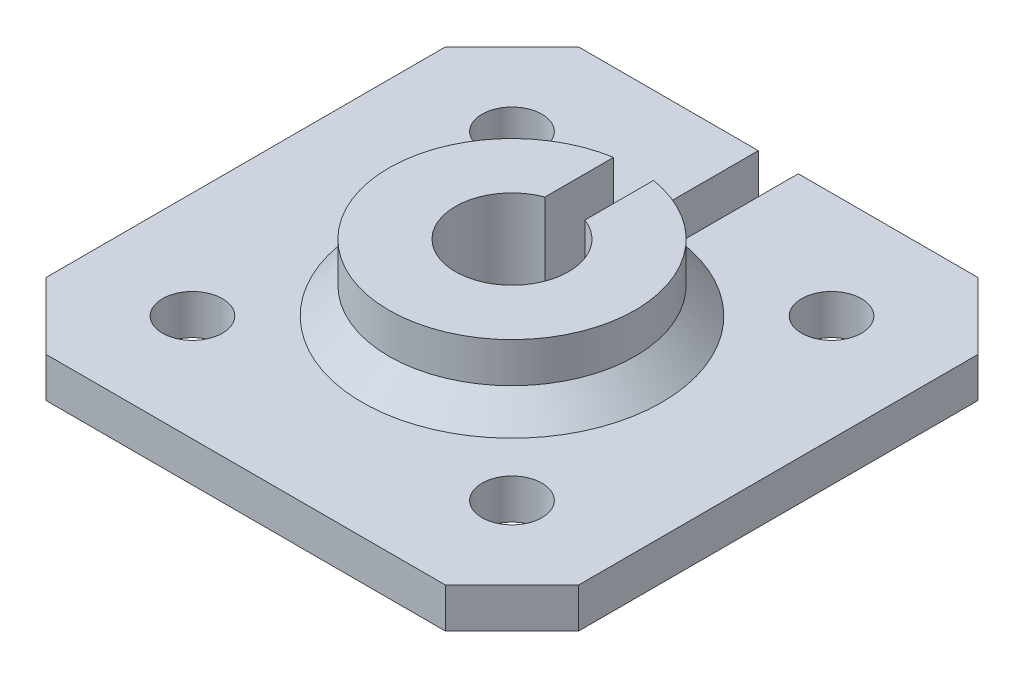
ISO-10303-21;
HEADER;
FILE_DESCRIPTION(('STEP AP214'),'2;1');
FILE_NAME('part.step','',(''),(''),'','','');
FILE_SCHEMA(('AUTOMOTIVE_DESIGN { 1 0 10303 214 1 1 1 1 }'));
ENDSEC;
DATA;
#1=APPLICATION_CONTEXT('core data for automotive mechanical design processes');
#2=APPLICATION_PROTOCOL_DEFINITION('international standard','automotive_design',2000,#1);
#3=PRODUCT_CONTEXT('',#1,'mechanical');
#4=PRODUCT('Part','Part','',(#3));
#5=PRODUCT_RELATED_PRODUCT_CATEGORY('part','',(#4));
#6=PRODUCT_DEFINITION_FORMATION('','',#4);
#7=PRODUCT_DEFINITION_CONTEXT('part definition',#1,'design');
#8=PRODUCT_DEFINITION('design','',#6,#7);
#9=PRODUCT_DEFINITION_SHAPE('','',#8);
#10=(LENGTH_UNIT() NAMED_UNIT(*) SI_UNIT(.MILLI.,.METRE.));
#11=(NAMED_UNIT(*) PLANE_ANGLE_UNIT() SI_UNIT($,.RADIAN.));
#12=(NAMED_UNIT(*) SI_UNIT($,.STERADIAN.) SOLID_ANGLE_UNIT());
#13=UNCERTAINTY_MEASURE_WITH_UNIT(LENGTH_MEASURE(1.E-05),#10,'distance_accuracy_value','');
#14=(GEOMETRIC_REPRESENTATION_CONTEXT(3) GLOBAL_UNCERTAINTY_ASSIGNED_CONTEXT((#13)) GLOBAL_UNIT_ASSIGNED_CONTEXT((#10,
#11,#12)) REPRESENTATION_CONTEXT('',''));
#15=CARTESIAN_POINT('',(0.,0.,0.));
#16=DIRECTION('',(0.,0.,1.));
#17=DIRECTION('',(1.,0.,0.));
#18=AXIS2_PLACEMENT_3D('',#15,#16,#17);
#19=CARTESIAN_POINT('',(0.,3.,0.));
#20=DIRECTION('',(0.,1.,0.));
#21=DIRECTION('',(0.,0.,1.));
#22=AXIS2_PLACEMENT_3D('',#19,#20,#21);
#23=PLANE('',#22);
#24=CARTESIAN_POINT('',(12.,3.,12.));
#25=DIRECTION('',(0.,1.,0.));
#26=DIRECTION('',(0.,0.,1.));
#27=AXIS2_PLACEMENT_3D('',#24,#25,#26);
#28=CIRCLE('',#27,2.25);
#29=CARTESIAN_POINT('',(12.,3.,14.25));
#30=VERTEX_POINT('',#29);
#31=EDGE_CURVE('E193',#30,#30,#28,.T.);
#32=ORIENTED_EDGE('',*,*,#31,.F.);
#33=EDGE_LOOP('',(#32));
#34=FACE_BOUND('',#33,.T.);
#35=CARTESIAN_POINT('',(-12.,3.,-12.));
#36=DIRECTION('',(0.,1.,0.));
#37=DIRECTION('',(0.,0.,1.));
#38=AXIS2_PLACEMENT_3D('',#35,#36,#37);
#39=CIRCLE('',#38,2.25);
#40=CARTESIAN_POINT('',(-12.,3.,-9.75));
#41=VERTEX_POINT('',#40);
#42=EDGE_CURVE('E205',#41,#41,#39,.T.);
#43=ORIENTED_EDGE('',*,*,#42,.F.);
#44=EDGE_LOOP('',(#43));
#45=FACE_BOUND('',#44,.T.);
#46=CARTESIAN_POINT('',(-12.,3.,12.));
#47=DIRECTION('',(0.,1.,0.));
#48=DIRECTION('',(0.,0.,1.));
#49=AXIS2_PLACEMENT_3D('',#46,#47,#48);
#50=CIRCLE('',#49,2.25);
#51=CARTESIAN_POINT('',(-12.,3.,14.25));
#52=VERTEX_POINT('',#51);
#53=EDGE_CURVE('E211',#52,#52,#50,.T.);
#54=ORIENTED_EDGE('',*,*,#53,.F.);
#55=EDGE_LOOP('',(#54));
#56=FACE_BOUND('',#55,.T.);
#57=CARTESIAN_POINT('',(12.,3.,-12.));
#58=DIRECTION('',(0.,1.,0.));
#59=DIRECTION('',(0.,0.,1.));
#60=AXIS2_PLACEMENT_3D('',#57,#58,#59);
#61=CIRCLE('',#60,2.25);
#62=CARTESIAN_POINT('',(12.,3.,-9.75));
#63=VERTEX_POINT('',#62);
#64=EDGE_CURVE('E199',#63,#63,#61,.T.);
#65=ORIENTED_EDGE('',*,*,#64,.F.);
#66=EDGE_LOOP('',(#65));
#67=FACE_BOUND('',#66,.T.);
#68=DIRECTION('',(0.,0.,1.));
#69=VECTOR('',#68,1.);
#70=CARTESIAN_POINT('',(1.5,3.,0.));
#71=LINE('',#70,#69);
#72=CARTESIAN_POINT('',(1.5,3.,-20.));
#73=VERTEX_POINT('',#72);
#74=CARTESIAN_POINT('',(1.5,3.,-11.1495515604889));
#75=VERTEX_POINT('',#74);
#76=EDGE_CURVE('E160',#73,#75,#71,.T.);
#77=ORIENTED_EDGE('',*,*,#76,.T.);
#78=CARTESIAN_POINT('',(0.,3.,0.));
#79=DIRECTION('',(0.,1.,0.));
#80=DIRECTION('',(0.,0.,1.));
#81=AXIS2_PLACEMENT_3D('',#78,#79,#80);
#82=CIRCLE('',#81,11.25);
#83=CARTESIAN_POINT('',(-1.5,3.,-11.1495515604889));
#84=VERTEX_POINT('',#83);
#85=EDGE_CURVE('E52',#75,#84,#82,.F.);
#86=ORIENTED_EDGE('',*,*,#85,.T.);
#87=DIRECTION('',(0.,0.,1.));
#88=VECTOR('',#87,1.);
#89=CARTESIAN_POINT('',(-1.5,3.,0.));
#90=LINE('',#89,#88);
#91=CARTESIAN_POINT('',(-1.5,3.,-20.));
#92=VERTEX_POINT('',#91);
#93=EDGE_CURVE('E161',#92,#84,#90,.T.);
#94=ORIENTED_EDGE('',*,*,#93,.F.);
#95=DIRECTION('',(-1.,0.,0.));
#96=VECTOR('',#95,1.);
#97=CARTESIAN_POINT('',(-20.,3.,-20.));
#98=LINE('',#97,#96);
#99=CARTESIAN_POINT('',(-15.,3.,-20.));
#100=VERTEX_POINT('',#99);
#101=EDGE_CURVE('E221',#92,#100,#98,.T.);
#102=ORIENTED_EDGE('',*,*,#101,.T.);
#103=DIRECTION('',(0.707106781186549,0.,-0.707106781186546));
#104=VECTOR('',#103,1.);
#105=CARTESIAN_POINT('',(-17.5,3.,-17.5));
#106=LINE('',#105,#104);
#107=CARTESIAN_POINT('',(-20.,3.,-15.));
#108=VERTEX_POINT('',#107);
#109=EDGE_CURVE('E258',#100,#108,#106,.F.);
#110=ORIENTED_EDGE('',*,*,#109,.T.);
#111=DIRECTION('',(0.,0.,1.));
#112=VECTOR('',#111,1.);
#113=CARTESIAN_POINT('',(-20.,3.,-20.));
#114=LINE('',#113,#112);
#115=CARTESIAN_POINT('',(-20.,3.,15.));
#116=VERTEX_POINT('',#115);
#117=EDGE_CURVE('E225',#108,#116,#114,.T.);
#118=ORIENTED_EDGE('',*,*,#117,.T.);
#119=DIRECTION('',(-0.707106781186546,0.,-0.707106781186549));
#120=VECTOR('',#119,1.);
#121=CARTESIAN_POINT('',(-17.5,3.,17.5));
#122=LINE('',#121,#120);
#123=CARTESIAN_POINT('',(-15.,3.,20.));
#124=VERTEX_POINT('',#123);
#125=EDGE_CURVE('E256',#116,#124,#122,.F.);
#126=ORIENTED_EDGE('',*,*,#125,.T.);
#127=DIRECTION('',(1.,0.,0.));
#128=VECTOR('',#127,1.);
#129=CARTESIAN_POINT('',(-20.,3.,20.));
#130=LINE('',#129,#128);
#131=CARTESIAN_POINT('',(15.,3.,20.));
#132=VERTEX_POINT('',#131);
#133=EDGE_CURVE('E228',#124,#132,#130,.T.);
#134=ORIENTED_EDGE('',*,*,#133,.T.);
#135=DIRECTION('',(-0.707106781186549,0.,0.707106781186546));
#136=VECTOR('',#135,1.);
#137=CARTESIAN_POINT('',(17.5,3.,17.5));
#138=LINE('',#137,#136);
#139=CARTESIAN_POINT('',(20.,3.,15.));
#140=VERTEX_POINT('',#139);
#141=EDGE_CURVE('E260',#132,#140,#138,.F.);
#142=ORIENTED_EDGE('',*,*,#141,.T.);
#143=DIRECTION('',(0.,0.,-1.));
#144=VECTOR('',#143,1.);
#145=CARTESIAN_POINT('',(20.,3.,-20.));
#146=LINE('',#145,#144);
#147=CARTESIAN_POINT('',(20.,3.,-15.));
#148=VERTEX_POINT('',#147);
#149=EDGE_CURVE('E218',#140,#148,#146,.T.);
#150=ORIENTED_EDGE('',*,*,#149,.T.);
#151=DIRECTION('',(0.707106781186546,0.,0.707106781186549));
#152=VECTOR('',#151,1.);
#153=CARTESIAN_POINT('',(17.5,3.,-17.5));
#154=LINE('',#153,#152);
#155=CARTESIAN_POINT('',(15.,3.,-20.));
#156=VERTEX_POINT('',#155);
#157=EDGE_CURVE('E262',#148,#156,#154,.F.);
#158=ORIENTED_EDGE('',*,*,#157,.T.);
#159=EDGE_CURVE('E223',#156,#73,#98,.T.);
#160=ORIENTED_EDGE('',*,*,#159,.T.);
#161=EDGE_LOOP('',(#77,#86,#94,#102,#110,#118,#126,#134,#142,#150,#158,#160));
#162=FACE_BOUND('',#161,.T.);
#163=ADVANCED_FACE('F32',(#34,#45,#56,#67,#162),#23,.T.);
#164=CARTESIAN_POINT('',(0.,0.,0.));
#165=DIRECTION('',(0.,1.,0.));
#166=DIRECTION('',(0.,0.,1.));
#167=AXIS2_PLACEMENT_3D('',#164,#165,#166);
#168=PLANE('',#167);
#169=CARTESIAN_POINT('',(12.,0.,12.));
#170=DIRECTION('',(0.,1.,0.));
#171=DIRECTION('',(0.,0.,1.));
#172=AXIS2_PLACEMENT_3D('',#169,#170,#171);
#173=CIRCLE('',#172,2.25);
#174=CARTESIAN_POINT('',(12.,0.,14.25));
#175=VERTEX_POINT('',#174);
#176=EDGE_CURVE('E192',#175,#175,#173,.T.);
#177=ORIENTED_EDGE('',*,*,#176,.T.);
#178=EDGE_LOOP('',(#177));
#179=FACE_BOUND('',#178,.T.);
#180=CARTESIAN_POINT('',(12.,0.,-12.));
#181=DIRECTION('',(0.,1.,0.));
#182=DIRECTION('',(0.,0.,1.));
#183=AXIS2_PLACEMENT_3D('',#180,#181,#182);
#184=CIRCLE('',#183,2.25);
#185=CARTESIAN_POINT('',(12.,0.,-9.75));
#186=VERTEX_POINT('',#185);
#187=EDGE_CURVE('E196',#186,#186,#184,.T.);
#188=ORIENTED_EDGE('',*,*,#187,.T.);
#189=EDGE_LOOP('',(#188));
#190=FACE_BOUND('',#189,.T.);
#191=CARTESIAN_POINT('',(-12.,0.,-12.));
#192=DIRECTION('',(0.,1.,0.));
#193=DIRECTION('',(0.,0.,1.));
#194=AXIS2_PLACEMENT_3D('',#191,#192,#193);
#195=CIRCLE('',#194,2.25);
#196=CARTESIAN_POINT('',(-12.,0.,-9.75));
#197=VERTEX_POINT('',#196);
#198=EDGE_CURVE('E202',#197,#197,#195,.T.);
#199=ORIENTED_EDGE('',*,*,#198,.T.);
#200=EDGE_LOOP('',(#199));
#201=FACE_BOUND('',#200,.T.);
#202=CARTESIAN_POINT('',(-12.,0.,12.));
#203=DIRECTION('',(0.,1.,0.));
#204=DIRECTION('',(0.,0.,1.));
#205=AXIS2_PLACEMENT_3D('',#202,#203,#204);
#206=CIRCLE('',#205,2.25);
#207=CARTESIAN_POINT('',(-12.,0.,14.25));
#208=VERTEX_POINT('',#207);
#209=EDGE_CURVE('E208',#208,#208,#206,.T.);
#210=ORIENTED_EDGE('',*,*,#209,.T.);
#211=EDGE_LOOP('',(#210));
#212=FACE_BOUND('',#211,.T.);
#213=DIRECTION('',(-1.,0.,0.));
#214=VECTOR('',#213,1.);
#215=CARTESIAN_POINT('',(-20.,0.,-20.));
#216=LINE('',#215,#214);
#217=CARTESIAN_POINT('',(15.,0.,-20.));
#218=VERTEX_POINT('',#217);
#219=CARTESIAN_POINT('',(1.5,0.,-20.));
#220=VERTEX_POINT('',#219);
#221=EDGE_CURVE('E145',#218,#220,#216,.T.);
#222=ORIENTED_EDGE('',*,*,#221,.F.);
#223=DIRECTION('',(-0.707106781186546,0.,-0.707106781186549));
#224=VECTOR('',#223,1.);
#225=CARTESIAN_POINT('',(15.,0.,-20.));
#226=LINE('',#225,#224);
#227=CARTESIAN_POINT('',(20.,0.,-15.));
#228=VERTEX_POINT('',#227);
#229=EDGE_CURVE('E249',#218,#228,#226,.F.);
#230=ORIENTED_EDGE('',*,*,#229,.T.);
#231=DIRECTION('',(0.,0.,-1.));
#232=VECTOR('',#231,1.);
#233=CARTESIAN_POINT('',(20.,0.,-20.));
#234=LINE('',#233,#232);
#235=CARTESIAN_POINT('',(20.,0.,15.));
#236=VERTEX_POINT('',#235);
#237=EDGE_CURVE('E217',#236,#228,#234,.T.);
#238=ORIENTED_EDGE('',*,*,#237,.F.);
#239=DIRECTION('',(0.707106781186549,0.,-0.707106781186546));
#240=VECTOR('',#239,1.);
#241=CARTESIAN_POINT('',(20.,0.,15.));
#242=LINE('',#241,#240);
#243=CARTESIAN_POINT('',(15.,0.,20.));
#244=VERTEX_POINT('',#243);
#245=EDGE_CURVE('E247',#236,#244,#242,.F.);
#246=ORIENTED_EDGE('',*,*,#245,.T.);
#247=DIRECTION('',(1.,0.,0.));
#248=VECTOR('',#247,1.);
#249=CARTESIAN_POINT('',(-20.,0.,20.));
#250=LINE('',#249,#248);
#251=CARTESIAN_POINT('',(-15.,0.,20.));
#252=VERTEX_POINT('',#251);
#253=EDGE_CURVE('E222',#252,#244,#250,.T.);
#254=ORIENTED_EDGE('',*,*,#253,.F.);
#255=DIRECTION('',(0.707106781186546,0.,0.707106781186549));
#256=VECTOR('',#255,1.);
#257=CARTESIAN_POINT('',(-15.,0.,20.));
#258=LINE('',#257,#256);
#259=CARTESIAN_POINT('',(-20.,0.,15.));
#260=VERTEX_POINT('',#259);
#261=EDGE_CURVE('E243',#252,#260,#258,.F.);
#262=ORIENTED_EDGE('',*,*,#261,.T.);
#263=DIRECTION('',(0.,0.,1.));
#264=VECTOR('',#263,1.);
#265=CARTESIAN_POINT('',(-20.,0.,-20.));
#266=LINE('',#265,#264);
#267=CARTESIAN_POINT('',(-20.,0.,-15.));
#268=VERTEX_POINT('',#267);
#269=EDGE_CURVE('E154',#268,#260,#266,.T.);
#270=ORIENTED_EDGE('',*,*,#269,.F.);
#271=DIRECTION('',(-0.707106781186549,0.,0.707106781186546));
#272=VECTOR('',#271,1.);
#273=CARTESIAN_POINT('',(-20.,0.,-15.));
#274=LINE('',#273,#272);
#275=CARTESIAN_POINT('',(-15.,0.,-20.));
#276=VERTEX_POINT('',#275);
#277=EDGE_CURVE('E245',#268,#276,#274,.F.);
#278=ORIENTED_EDGE('',*,*,#277,.T.);
#279=CARTESIAN_POINT('',(-1.5,0.,-20.));
#280=VERTEX_POINT('',#279);
#281=EDGE_CURVE('E155',#280,#276,#216,.T.);
#282=ORIENTED_EDGE('',*,*,#281,.F.);
#283=DIRECTION('',(0.,0.,-1.));
#284=VECTOR('',#283,1.);
#285=CARTESIAN_POINT('',(-1.5,0.,0.));
#286=LINE('',#285,#284);
#287=CARTESIAN_POINT('',(-1.5,0.,-3.97649343014672));
#288=VERTEX_POINT('',#287);
#289=EDGE_CURVE('E169',#288,#280,#286,.T.);
#290=ORIENTED_EDGE('',*,*,#289,.F.);
#291=CARTESIAN_POINT('',(0.,0.,0.));
#292=DIRECTION('',(0.,1.,0.));
#293=DIRECTION('',(0.,0.,1.));
#294=AXIS2_PLACEMENT_3D('',#291,#292,#293);
#295=CIRCLE('',#294,4.25);
#296=CARTESIAN_POINT('',(1.5,0.,-3.97649343014672));
#297=VERTEX_POINT('',#296);
#298=EDGE_CURVE('E168',#288,#297,#295,.T.);
#299=ORIENTED_EDGE('',*,*,#298,.T.);
#300=DIRECTION('',(0.,0.,-1.));
#301=VECTOR('',#300,1.);
#302=CARTESIAN_POINT('',(1.5,0.,0.));
#303=LINE('',#302,#301);
#304=EDGE_CURVE('E158',#297,#220,#303,.T.);
#305=ORIENTED_EDGE('',*,*,#304,.T.);
#306=EDGE_LOOP('',(#222,#230,#238,#246,#254,#262,#270,#278,#282,#290,#299,#305));
#307=FACE_BOUND('',#306,.T.);
#308=ADVANCED_FACE('F165',(#179,#190,#201,#212,#307),#168,.F.);
#309=CARTESIAN_POINT('',(-20.,3.,-20.));
#310=DIRECTION('',(0.,0.,1.));
#311=DIRECTION('',(1.,0.,0.));
#312=AXIS2_PLACEMENT_3D('',#309,#310,#311);
#313=PLANE('',#312);
#314=ORIENTED_EDGE('',*,*,#159,.F.);
#315=DIRECTION('',(0.,-1.,0.));
#316=VECTOR('',#315,1.);
#317=CARTESIAN_POINT('',(15.,3.,-20.));
#318=LINE('',#317,#316);
#319=EDGE_CURVE('E151',#156,#218,#318,.T.);
#320=ORIENTED_EDGE('',*,*,#319,.T.);
#321=ORIENTED_EDGE('',*,*,#221,.T.);
#322=DIRECTION('',(0.,-1.,0.));
#323=VECTOR('',#322,1.);
#324=CARTESIAN_POINT('',(1.5,8.,-20.));
#325=LINE('',#324,#323);
#326=EDGE_CURVE('E149',#73,#220,#325,.T.);
#327=ORIENTED_EDGE('',*,*,#326,.F.);
#328=EDGE_LOOP('',(#314,#320,#321,#327));
#329=FACE_BOUND('',#328,.T.);
#330=ADVANCED_FACE('F148',(#329),#313,.F.);
#331=CARTESIAN_POINT('',(0.,3.,0.));
#332=DIRECTION('',(0.,-1.,0.));
#333=DIRECTION('',(0.,0.,-1.));
#334=AXIS2_PLACEMENT_3D('',#331,#332,#333);
#335=CYLINDRICAL_SURFACE('',#334,4.25);
#336=CARTESIAN_POINT('',(0.,8.,0.));
#337=DIRECTION('',(0.,1.,0.));
#338=DIRECTION('',(0.,0.,1.));
#339=AXIS2_PLACEMENT_3D('',#336,#337,#338);
#340=CIRCLE('',#339,4.25);
#341=CARTESIAN_POINT('',(-1.5,8.,-3.97649343014672));
#342=VERTEX_POINT('',#341);
#343=CARTESIAN_POINT('',(1.5,8.,-3.97649343014672));
#344=VERTEX_POINT('',#343);
#345=EDGE_CURVE('E186',#342,#344,#340,.T.);
#346=ORIENTED_EDGE('',*,*,#345,.T.);
#347=DIRECTION('',(0.,-1.,0.));
#348=VECTOR('',#347,1.);
#349=CARTESIAN_POINT('',(1.5,3.,-3.97649343014672));
#350=LINE('',#349,#348);
#351=EDGE_CURVE('E184',#344,#297,#350,.T.);
#352=ORIENTED_EDGE('',*,*,#351,.T.);
#353=ORIENTED_EDGE('',*,*,#298,.F.);
#354=DIRECTION('',(0.,-1.,0.));
#355=VECTOR('',#354,1.);
#356=CARTESIAN_POINT('',(-1.5,3.,-3.97649343014672));
#357=LINE('',#356,#355);
#358=EDGE_CURVE('E181',#342,#288,#357,.T.);
#359=ORIENTED_EDGE('',*,*,#358,.F.);
#360=EDGE_LOOP('',(#346,#352,#353,#359));
#361=FACE_BOUND('',#360,.T.);
#362=ADVANCED_FACE('F293',(#361),#335,.F.);
#363=CARTESIAN_POINT('',(0.,8.,0.));
#364=DIRECTION('',(0.,1.,0.));
#365=DIRECTION('',(0.,0.,1.));
#366=AXIS2_PLACEMENT_3D('',#363,#364,#365);
#367=PLANE('',#366);
#368=CARTESIAN_POINT('',(0.,8.,0.));
#369=DIRECTION('',(0.,1.,0.));
#370=DIRECTION('',(0.,0.,1.));
#371=AXIS2_PLACEMENT_3D('',#368,#369,#370);
#372=CIRCLE('',#371,9.25);
#373=CARTESIAN_POINT('',(-1.5,8.,-9.12756813176434));
#374=VERTEX_POINT('',#373);
#375=CARTESIAN_POINT('',(1.5,8.,-9.12756813176434));
#376=VERTEX_POINT('',#375);
#377=EDGE_CURVE('E189',#374,#376,#372,.T.);
#378=ORIENTED_EDGE('',*,*,#377,.T.);
#379=DIRECTION('',(0.,0.,-1.));
#380=VECTOR('',#379,1.);
#381=CARTESIAN_POINT('',(1.5,8.,0.));
#382=LINE('',#381,#380);
#383=EDGE_CURVE('E171',#344,#376,#382,.T.);
#384=ORIENTED_EDGE('',*,*,#383,.F.);
#385=ORIENTED_EDGE('',*,*,#345,.F.);
#386=DIRECTION('',(0.,0.,-1.));
#387=VECTOR('',#386,1.);
#388=CARTESIAN_POINT('',(-1.5,8.,0.));
#389=LINE('',#388,#387);
#390=EDGE_CURVE('E175',#342,#374,#389,.T.);
#391=ORIENTED_EDGE('',*,*,#390,.T.);
#392=EDGE_LOOP('',(#378,#384,#385,#391));
#393=FACE_BOUND('',#392,.T.);
#394=ADVANCED_FACE('F289',(#393),#367,.T.);
#395=CARTESIAN_POINT('',(0.,8.,0.));
#396=DIRECTION('',(0.,-1.,0.));
#397=DIRECTION('',(0.,0.,-1.));
#398=AXIS2_PLACEMENT_3D('',#395,#396,#397);
#399=CYLINDRICAL_SURFACE('',#398,9.25);
#400=DIRECTION('',(0.,-1.,0.));
#401=VECTOR('',#400,1.);
#402=CARTESIAN_POINT('',(-1.5,8.,-9.12756813176434));
#403=LINE('',#402,#401);
#404=CARTESIAN_POINT('',(-1.5,5.00000000000002,-9.12756813176434));
#405=VERTEX_POINT('',#404);
#406=EDGE_CURVE('E231',#374,#405,#403,.T.);
#407=ORIENTED_EDGE('',*,*,#406,.T.);
#408=CARTESIAN_POINT('',(0.,5.00000000000002,0.));
#409=DIRECTION('',(0.,1.,0.));
#410=DIRECTION('',(0.,0.,1.));
#411=AXIS2_PLACEMENT_3D('',#408,#409,#410);
#412=CIRCLE('',#411,9.25);
#413=CARTESIAN_POINT('',(1.5,5.00000000000002,-9.12756813176434));
#414=VERTEX_POINT('',#413);
#415=EDGE_CURVE('E276',#405,#414,#412,.T.);
#416=ORIENTED_EDGE('',*,*,#415,.T.);
#417=DIRECTION('',(0.,-1.,0.));
#418=VECTOR('',#417,1.);
#419=CARTESIAN_POINT('',(1.5,8.,-9.12756813176434));
#420=LINE('',#419,#418);
#421=EDGE_CURVE('E240',#376,#414,#420,.T.);
#422=ORIENTED_EDGE('',*,*,#421,.F.);
#423=ORIENTED_EDGE('',*,*,#377,.F.);
#424=EDGE_LOOP('',(#407,#416,#422,#423));
#425=FACE_BOUND('',#424,.T.);
#426=ADVANCED_FACE('F292',(#425),#399,.T.);
#427=CARTESIAN_POINT('',(20.,3.,-20.));
#428=DIRECTION('',(-1.,0.,0.));
#429=DIRECTION('',(0.,0.,1.));
#430=AXIS2_PLACEMENT_3D('',#427,#428,#429);
#431=PLANE('',#430);
#432=ORIENTED_EDGE('',*,*,#237,.T.);
#433=DIRECTION('',(0.,1.,0.));
#434=VECTOR('',#433,1.);
#435=CARTESIAN_POINT('',(20.,3.,-15.));
#436=LINE('',#435,#434);
#437=EDGE_CURVE('E254',#228,#148,#436,.T.);
#438=ORIENTED_EDGE('',*,*,#437,.T.);
#439=ORIENTED_EDGE('',*,*,#149,.F.);
#440=DIRECTION('',(0.,-1.,0.));
#441=VECTOR('',#440,1.);
#442=CARTESIAN_POINT('',(20.,3.,15.));
#443=LINE('',#442,#441);
#444=EDGE_CURVE('E251',#140,#236,#443,.T.);
#445=ORIENTED_EDGE('',*,*,#444,.T.);
#446=EDGE_LOOP('',(#432,#438,#439,#445));
#447=FACE_BOUND('',#446,.T.);
#448=ADVANCED_FACE('F297',(#447),#431,.F.);
#449=ORIENTED_EDGE('',*,*,#281,.T.);
#450=DIRECTION('',(0.,1.,0.));
#451=VECTOR('',#450,1.);
#452=CARTESIAN_POINT('',(-15.,3.,-20.));
#453=LINE('',#452,#451);
#454=EDGE_CURVE('E274',#276,#100,#453,.T.);
#455=ORIENTED_EDGE('',*,*,#454,.T.);
#456=ORIENTED_EDGE('',*,*,#101,.F.);
#457=DIRECTION('',(0.,-1.,0.));
#458=VECTOR('',#457,1.);
#459=CARTESIAN_POINT('',(-1.5,8.,-20.));
#460=LINE('',#459,#458);
#461=EDGE_CURVE('E162',#92,#280,#460,.T.);
#462=ORIENTED_EDGE('',*,*,#461,.T.);
#463=EDGE_LOOP('',(#449,#455,#456,#462));
#464=FACE_BOUND('',#463,.T.);
#465=ADVANCED_FACE('F331',(#464),#313,.F.);
#466=CARTESIAN_POINT('',(-20.,3.,-20.));
#467=DIRECTION('',(1.,0.,0.));
#468=DIRECTION('',(0.,0.,-1.));
#469=AXIS2_PLACEMENT_3D('',#466,#467,#468);
#470=PLANE('',#469);
#471=ORIENTED_EDGE('',*,*,#117,.F.);
#472=DIRECTION('',(0.,-1.,0.));
#473=VECTOR('',#472,1.);
#474=CARTESIAN_POINT('',(-20.,3.,-15.));
#475=LINE('',#474,#473);
#476=EDGE_CURVE('E271',#108,#268,#475,.T.);
#477=ORIENTED_EDGE('',*,*,#476,.T.);
#478=ORIENTED_EDGE('',*,*,#269,.T.);
#479=DIRECTION('',(0.,1.,0.));
#480=VECTOR('',#479,1.);
#481=CARTESIAN_POINT('',(-20.,3.,15.));
#482=LINE('',#481,#480);
#483=EDGE_CURVE('E269',#260,#116,#482,.T.);
#484=ORIENTED_EDGE('',*,*,#483,.T.);
#485=EDGE_LOOP('',(#471,#477,#478,#484));
#486=FACE_BOUND('',#485,.T.);
#487=ADVANCED_FACE('F327',(#486),#470,.F.);
#488=CARTESIAN_POINT('',(-20.,3.,20.));
#489=DIRECTION('',(0.,0.,-1.));
#490=DIRECTION('',(-1.,0.,0.));
#491=AXIS2_PLACEMENT_3D('',#488,#489,#490);
#492=PLANE('',#491);
#493=ORIENTED_EDGE('',*,*,#253,.T.);
#494=DIRECTION('',(0.,1.,0.));
#495=VECTOR('',#494,1.);
#496=CARTESIAN_POINT('',(15.,3.,20.));
#497=LINE('',#496,#495);
#498=EDGE_CURVE('E267',#244,#132,#497,.T.);
#499=ORIENTED_EDGE('',*,*,#498,.T.);
#500=ORIENTED_EDGE('',*,*,#133,.F.);
#501=DIRECTION('',(0.,-1.,0.));
#502=VECTOR('',#501,1.);
#503=CARTESIAN_POINT('',(-15.,3.,20.));
#504=LINE('',#503,#502);
#505=EDGE_CURVE('E264',#124,#252,#504,.T.);
#506=ORIENTED_EDGE('',*,*,#505,.T.);
#507=EDGE_LOOP('',(#493,#499,#500,#506));
#508=FACE_BOUND('',#507,.T.);
#509=ADVANCED_FACE('F314',(#508),#492,.F.);
#510=CARTESIAN_POINT('',(-12.,3.,12.));
#511=DIRECTION('',(0.,-1.,0.));
#512=DIRECTION('',(0.,0.,-1.));
#513=AXIS2_PLACEMENT_3D('',#510,#511,#512);
#514=CYLINDRICAL_SURFACE('',#513,2.25);
#515=ORIENTED_EDGE('',*,*,#53,.T.);
#516=EDGE_LOOP('',(#515));
#517=FACE_BOUND('',#516,.T.);
#518=ORIENTED_EDGE('',*,*,#209,.F.);
#519=EDGE_LOOP('',(#518));
#520=FACE_BOUND('',#519,.T.);
#521=ADVANCED_FACE('F310',(#517,#520),#514,.F.);
#522=CARTESIAN_POINT('',(-12.,3.,-12.));
#523=DIRECTION('',(0.,-1.,0.));
#524=DIRECTION('',(0.,0.,-1.));
#525=AXIS2_PLACEMENT_3D('',#522,#523,#524);
#526=CYLINDRICAL_SURFACE('',#525,2.25);
#527=ORIENTED_EDGE('',*,*,#42,.T.);
#528=EDGE_LOOP('',(#527));
#529=FACE_BOUND('',#528,.T.);
#530=ORIENTED_EDGE('',*,*,#198,.F.);
#531=EDGE_LOOP('',(#530));
#532=FACE_BOUND('',#531,.T.);
#533=ADVANCED_FACE('F306',(#529,#532),#526,.F.);
#534=CARTESIAN_POINT('',(12.,3.,-12.));
#535=DIRECTION('',(0.,-1.,0.));
#536=DIRECTION('',(0.,0.,-1.));
#537=AXIS2_PLACEMENT_3D('',#534,#535,#536);
#538=CYLINDRICAL_SURFACE('',#537,2.25);
#539=ORIENTED_EDGE('',*,*,#64,.T.);
#540=EDGE_LOOP('',(#539));
#541=FACE_BOUND('',#540,.T.);
#542=ORIENTED_EDGE('',*,*,#187,.F.);
#543=EDGE_LOOP('',(#542));
#544=FACE_BOUND('',#543,.T.);
#545=ADVANCED_FACE('F302',(#541,#544),#538,.F.);
#546=CARTESIAN_POINT('',(12.,3.,12.));
#547=DIRECTION('',(0.,-1.,0.));
#548=DIRECTION('',(0.,0.,-1.));
#549=AXIS2_PLACEMENT_3D('',#546,#547,#548);
#550=CYLINDRICAL_SURFACE('',#549,2.25);
#551=ORIENTED_EDGE('',*,*,#31,.T.);
#552=EDGE_LOOP('',(#551));
#553=FACE_BOUND('',#552,.T.);
#554=ORIENTED_EDGE('',*,*,#176,.F.);
#555=EDGE_LOOP('',(#554));
#556=FACE_BOUND('',#555,.T.);
#557=ADVANCED_FACE('F299',(#553,#556),#550,.F.);
#558=CARTESIAN_POINT('',(-1.5,8.,0.));
#559=DIRECTION('',(-1.,0.,0.));
#560=DIRECTION('',(0.,0.,1.));
#561=AXIS2_PLACEMENT_3D('',#558,#559,#560);
#562=PLANE('',#561);
#563=ORIENTED_EDGE('',*,*,#358,.T.);
#564=ORIENTED_EDGE('',*,*,#289,.T.);
#565=ORIENTED_EDGE('',*,*,#461,.F.);
#566=ORIENTED_EDGE('',*,*,#93,.T.);
#567=CARTESIAN_POINT('',(-1.5,3.,-11.1495515604889));
#568=CARTESIAN_POINT('',(-1.5,3.16683167431924,-10.9812162209593));
#569=CARTESIAN_POINT('',(-1.5,3.33363011018487,-10.8128479300705));
#570=CARTESIAN_POINT('',(-1.5,3.66714894504491,-10.4760341737901));
#571=CARTESIAN_POINT('',(-1.5,3.83386934406204,-10.307588708421));
#572=CARTESIAN_POINT('',(-1.5,4.16722065554873,-9.97060922011695));
#573=CARTESIAN_POINT('',(-1.5,4.33385156801129,-9.80207519717495));
#574=CARTESIAN_POINT('',(-1.5,4.66700841320645,-9.46490332754749));
#575=CARTESIAN_POINT('',(-1.5,4.83353434590839,-9.29626548083171));
#576=CARTESIAN_POINT('',(-1.5,5.00000000000002,-9.12756813176434));
#577=B_SPLINE_CURVE_WITH_KNOTS('',3,(#567,#568,#569,#570,#571,#572,#573,#574,#575,#576),
.UNSPECIFIED.,.F.,.F.,(4,2,2,2,4),(0.,0.711003765331348,1.42200732343865,2.13301093711683,
2.8440147583923),.UNSPECIFIED.);
#578=EDGE_CURVE('E11',#84,#405,#577,.T.);
#579=ORIENTED_EDGE('',*,*,#578,.T.);
#580=ORIENTED_EDGE('',*,*,#406,.F.);
#581=ORIENTED_EDGE('',*,*,#390,.F.);
#582=EDGE_LOOP('',(#563,#564,#565,#566,#579,#580,#581));
#583=FACE_BOUND('',#582,.T.);
#584=ADVANCED_FACE('F287',(#583),#562,.F.);
#585=CARTESIAN_POINT('',(1.5,8.,0.));
#586=DIRECTION('',(-1.,0.,0.));
#587=DIRECTION('',(0.,0.,1.));
#588=AXIS2_PLACEMENT_3D('',#585,#586,#587);
#589=PLANE('',#588);
#590=ORIENTED_EDGE('',*,*,#383,.T.);
#591=ORIENTED_EDGE('',*,*,#421,.T.);
#592=CARTESIAN_POINT('',(1.5,5.00000000000002,-9.12756813176434));
#593=CARTESIAN_POINT('',(1.5,4.83353434590838,-9.29626548083171));
#594=CARTESIAN_POINT('',(1.5,4.66700841320645,-9.46490332754749));
#595=CARTESIAN_POINT('',(1.5,4.33385156801129,-9.80207519717495));
#596=CARTESIAN_POINT('',(1.5,4.16722065554873,-9.97060922011695));
#597=CARTESIAN_POINT('',(1.5,3.83386934406204,-10.307588708421));
#598=CARTESIAN_POINT('',(1.5,3.66714894504491,-10.4760341737901));
#599=CARTESIAN_POINT('',(1.5,3.33363011018488,-10.8128479300705));
#600=CARTESIAN_POINT('',(1.5,3.16683167431925,-10.9812162209593));
#601=CARTESIAN_POINT('',(1.5,3.,-11.1495515604889));
#602=B_SPLINE_CURVE_WITH_KNOTS('',3,(#592,#593,#594,#595,#596,#597,#598,#599,#600,#601),
.UNSPECIFIED.,.F.,.F.,(4,2,2,2,4),(0.,0.711003821275467,1.42200743495365,2.13301099306095,
2.8440147583923),.UNSPECIFIED.);
#603=EDGE_CURVE('E45',#414,#75,#602,.T.);
#604=ORIENTED_EDGE('',*,*,#603,.T.);
#605=ORIENTED_EDGE('',*,*,#76,.F.);
#606=ORIENTED_EDGE('',*,*,#326,.T.);
#607=ORIENTED_EDGE('',*,*,#304,.F.);
#608=ORIENTED_EDGE('',*,*,#351,.F.);
#609=EDGE_LOOP('',(#590,#591,#604,#605,#606,#607,#608));
#610=FACE_BOUND('',#609,.T.);
#611=ADVANCED_FACE('F157',(#610),#589,.T.);
#612=CARTESIAN_POINT('',(15.,3.,-20.));
#613=DIRECTION('',(-0.707106781186549,0.,0.707106781186546));
#614=DIRECTION('',(0.,-1.,0.));
#615=AXIS2_PLACEMENT_3D('',#612,#613,#614);
#616=PLANE('',#615);
#617=ORIENTED_EDGE('',*,*,#157,.F.);
#618=ORIENTED_EDGE('',*,*,#437,.F.);
#619=ORIENTED_EDGE('',*,*,#229,.F.);
#620=ORIENTED_EDGE('',*,*,#319,.F.);
#621=EDGE_LOOP('',(#617,#618,#619,#620));
#622=FACE_BOUND('',#621,.T.);
#623=ADVANCED_FACE('F286',(#622),#616,.F.);
#624=CARTESIAN_POINT('',(20.,3.,15.));
#625=DIRECTION('',(-0.707106781186546,0.,-0.707106781186549));
#626=DIRECTION('',(0.,-1.,0.));
#627=AXIS2_PLACEMENT_3D('',#624,#625,#626);
#628=PLANE('',#627);
#629=ORIENTED_EDGE('',*,*,#141,.F.);
#630=ORIENTED_EDGE('',*,*,#498,.F.);
#631=ORIENTED_EDGE('',*,*,#245,.F.);
#632=ORIENTED_EDGE('',*,*,#444,.F.);
#633=EDGE_LOOP('',(#629,#630,#631,#632));
#634=FACE_BOUND('',#633,.T.);
#635=ADVANCED_FACE('F341',(#634),#628,.F.);
#636=CARTESIAN_POINT('',(-20.,3.,-15.));
#637=DIRECTION('',(0.707106781186546,0.,0.707106781186549));
#638=DIRECTION('',(0.,-1.,0.));
#639=AXIS2_PLACEMENT_3D('',#636,#637,#638);
#640=PLANE('',#639);
#641=ORIENTED_EDGE('',*,*,#109,.F.);
#642=ORIENTED_EDGE('',*,*,#454,.F.);
#643=ORIENTED_EDGE('',*,*,#277,.F.);
#644=ORIENTED_EDGE('',*,*,#476,.F.);
#645=EDGE_LOOP('',(#641,#642,#643,#644));
#646=FACE_BOUND('',#645,.T.);
#647=ADVANCED_FACE('F345',(#646),#640,.F.);
#648=CARTESIAN_POINT('',(-15.,3.,20.));
#649=DIRECTION('',(0.707106781186549,0.,-0.707106781186546));
#650=DIRECTION('',(0.,-1.,0.));
#651=AXIS2_PLACEMENT_3D('',#648,#649,#650);
#652=PLANE('',#651);
#653=ORIENTED_EDGE('',*,*,#125,.F.);
#654=ORIENTED_EDGE('',*,*,#483,.F.);
#655=ORIENTED_EDGE('',*,*,#261,.F.);
#656=ORIENTED_EDGE('',*,*,#505,.F.);
#657=EDGE_LOOP('',(#653,#654,#655,#656));
#658=FACE_BOUND('',#657,.T.);
#659=ADVANCED_FACE('F348',(#658),#652,.F.);
#660=CARTESIAN_POINT('',(0.,5.00000000000002,0.));
#661=DIRECTION('',(0.,-1.,0.));
#662=DIRECTION('',(0.,0.,-1.));
#663=AXIS2_PLACEMENT_3D('',#660,#661,#662);
#664=CONICAL_SURFACE('',#663,9.25,0.785398163397445);
#665=ORIENTED_EDGE('',*,*,#578,.F.);
#666=ORIENTED_EDGE('',*,*,#85,.F.);
#667=ORIENTED_EDGE('',*,*,#603,.F.);
#668=ORIENTED_EDGE('',*,*,#415,.F.);
#669=EDGE_LOOP('',(#665,#666,#667,#668));
#670=FACE_BOUND('',#669,.T.);
#671=ADVANCED_FACE('F34',(#670),#664,.T.);
#672=CLOSED_SHELL('',(#163,#308,#330,#362,#394,#426,#448,#465,#487,#509,#521,#533,#545,#557,
#584,#611,#623,#635,#647,#659,#671));
#673=MANIFOLD_SOLID_BREP('B2',#672);
#674=ADVANCED_BREP_SHAPE_REPRESENTATION('',(#18,#673),#14);
#675=SHAPE_DEFINITION_REPRESENTATION(#9,#674);
ENDSEC;
END-ISO-10303-21;
